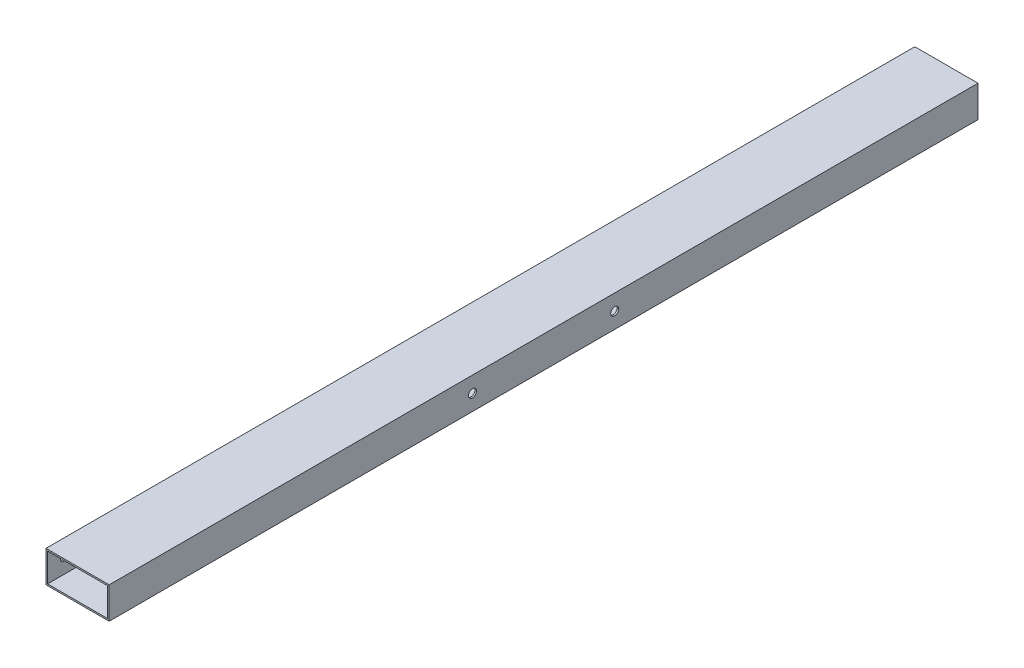
ISO-10303-21;
HEADER;
FILE_DESCRIPTION(('STEP AP214'),'2;1');
FILE_NAME('part.step','',(''),(''),'','','');
FILE_SCHEMA(('AUTOMOTIVE_DESIGN { 1 0 10303 214 1 1 1 1 }'));
ENDSEC;
DATA;
#1=APPLICATION_CONTEXT('core data for automotive mechanical design processes');
#2=APPLICATION_PROTOCOL_DEFINITION('international standard','automotive_design',2000,#1);
#3=PRODUCT_CONTEXT('',#1,'mechanical');
#4=PRODUCT('Part','Part','',(#3));
#5=PRODUCT_RELATED_PRODUCT_CATEGORY('part','',(#4));
#6=PRODUCT_DEFINITION_FORMATION('','',#4);
#7=PRODUCT_DEFINITION_CONTEXT('part definition',#1,'design');
#8=PRODUCT_DEFINITION('design','',#6,#7);
#9=PRODUCT_DEFINITION_SHAPE('','',#8);
#10=(LENGTH_UNIT() NAMED_UNIT(*) SI_UNIT(.MILLI.,.METRE.));
#11=(NAMED_UNIT(*) PLANE_ANGLE_UNIT() SI_UNIT($,.RADIAN.));
#12=(NAMED_UNIT(*) SI_UNIT($,.STERADIAN.) SOLID_ANGLE_UNIT());
#13=UNCERTAINTY_MEASURE_WITH_UNIT(LENGTH_MEASURE(1.E-05),#10,'distance_accuracy_value','');
#14=(GEOMETRIC_REPRESENTATION_CONTEXT(3) GLOBAL_UNCERTAINTY_ASSIGNED_CONTEXT((#13)) GLOBAL_UNIT_ASSIGNED_CONTEXT((#10,
#11,#12)) REPRESENTATION_CONTEXT('',''));
#15=CARTESIAN_POINT('',(0.,0.,0.));
#16=DIRECTION('',(0.,0.,1.));
#17=DIRECTION('',(1.,0.,0.));
#18=AXIS2_PLACEMENT_3D('',#15,#16,#17);
#19=CARTESIAN_POINT('',(0.,0.,550.));
#20=DIRECTION('',(0.,0.,1.));
#21=DIRECTION('',(1.,0.,0.));
#22=AXIS2_PLACEMENT_3D('',#19,#20,#21);
#23=PLANE('',#22);
#24=DIRECTION('',(0.,-1.,0.));
#25=VECTOR('',#24,1.);
#26=CARTESIAN_POINT('',(0.,0.,550.));
#27=LINE('',#26,#25);
#28=CARTESIAN_POINT('',(0.,0.,550.));
#29=VERTEX_POINT('',#28);
#30=CARTESIAN_POINT('',(0.,-20.,550.));
#31=VERTEX_POINT('',#30);
#32=EDGE_CURVE('E170',#29,#31,#27,.T.);
#33=ORIENTED_EDGE('',*,*,#32,.T.);
#34=DIRECTION('',(1.,0.,0.));
#35=VECTOR('',#34,1.);
#36=CARTESIAN_POINT('',(0.,-20.,550.));
#37=LINE('',#36,#35);
#38=CARTESIAN_POINT('',(40.,-20.,550.));
#39=VERTEX_POINT('',#38);
#40=EDGE_CURVE('E173',#31,#39,#37,.T.);
#41=ORIENTED_EDGE('',*,*,#40,.T.);
#42=DIRECTION('',(0.,1.,0.));
#43=VECTOR('',#42,1.);
#44=CARTESIAN_POINT('',(40.,0.,550.));
#45=LINE('',#44,#43);
#46=CARTESIAN_POINT('',(40.,0.,550.));
#47=VERTEX_POINT('',#46);
#48=EDGE_CURVE('E176',#39,#47,#45,.T.);
#49=ORIENTED_EDGE('',*,*,#48,.T.);
#50=DIRECTION('',(-1.,0.,0.));
#51=VECTOR('',#50,1.);
#52=CARTESIAN_POINT('',(0.,0.,550.));
#53=LINE('',#52,#51);
#54=EDGE_CURVE('E178',#47,#29,#53,.T.);
#55=ORIENTED_EDGE('',*,*,#54,.T.);
#56=EDGE_LOOP('',(#33,#41,#49,#55));
#57=FACE_BOUND('',#56,.T.);
#58=DIRECTION('',(1.,0.,0.));
#59=VECTOR('',#58,1.);
#60=CARTESIAN_POINT('',(0.,-19.,550.));
#61=LINE('',#60,#59);
#62=CARTESIAN_POINT('',(1.,-19.,550.));
#63=VERTEX_POINT('',#62);
#64=CARTESIAN_POINT('',(39.,-19.,550.));
#65=VERTEX_POINT('',#64);
#66=EDGE_CURVE('E140',#63,#65,#61,.T.);
#67=ORIENTED_EDGE('',*,*,#66,.F.);
#68=DIRECTION('',(0.,-1.,0.));
#69=VECTOR('',#68,1.);
#70=CARTESIAN_POINT('',(1.,0.,550.));
#71=LINE('',#70,#69);
#72=CARTESIAN_POINT('',(1.,-1.,550.));
#73=VERTEX_POINT('',#72);
#74=EDGE_CURVE('E132',#73,#63,#71,.T.);
#75=ORIENTED_EDGE('',*,*,#74,.F.);
#76=DIRECTION('',(-1.,0.,0.));
#77=VECTOR('',#76,1.);
#78=CARTESIAN_POINT('',(0.,-1.,550.));
#79=LINE('',#78,#77);
#80=CARTESIAN_POINT('',(39.,-1.,550.));
#81=VERTEX_POINT('',#80);
#82=EDGE_CURVE('E154',#81,#73,#79,.T.);
#83=ORIENTED_EDGE('',*,*,#82,.F.);
#84=DIRECTION('',(0.,1.,0.));
#85=VECTOR('',#84,1.);
#86=CARTESIAN_POINT('',(39.,0.,550.));
#87=LINE('',#86,#85);
#88=EDGE_CURVE('E152',#65,#81,#87,.T.);
#89=ORIENTED_EDGE('',*,*,#88,.F.);
#90=EDGE_LOOP('',(#67,#75,#83,#89));
#91=FACE_BOUND('',#90,.T.);
#92=ADVANCED_FACE('F65',(#57,#91),#23,.T.);
#93=CARTESIAN_POINT('',(0.,0.,0.));
#94=DIRECTION('',(0.,0.,1.));
#95=DIRECTION('',(1.,0.,0.));
#96=AXIS2_PLACEMENT_3D('',#93,#94,#95);
#97=PLANE('',#96);
#98=DIRECTION('',(0.,-1.,0.));
#99=VECTOR('',#98,1.);
#100=CARTESIAN_POINT('',(0.,0.,0.));
#101=LINE('',#100,#99);
#102=CARTESIAN_POINT('',(0.,0.,0.));
#103=VERTEX_POINT('',#102);
#104=CARTESIAN_POINT('',(0.,-20.,0.));
#105=VERTEX_POINT('',#104);
#106=EDGE_CURVE('E148',#103,#105,#101,.T.);
#107=ORIENTED_EDGE('',*,*,#106,.F.);
#108=DIRECTION('',(-1.,0.,0.));
#109=VECTOR('',#108,1.);
#110=CARTESIAN_POINT('',(0.,0.,0.));
#111=LINE('',#110,#109);
#112=CARTESIAN_POINT('',(40.,0.,0.));
#113=VERTEX_POINT('',#112);
#114=EDGE_CURVE('E174',#113,#103,#111,.T.);
#115=ORIENTED_EDGE('',*,*,#114,.F.);
#116=DIRECTION('',(0.,1.,0.));
#117=VECTOR('',#116,1.);
#118=CARTESIAN_POINT('',(40.,0.,0.));
#119=LINE('',#118,#117);
#120=CARTESIAN_POINT('',(40.,-20.,0.));
#121=VERTEX_POINT('',#120);
#122=EDGE_CURVE('E185',#121,#113,#119,.T.);
#123=ORIENTED_EDGE('',*,*,#122,.F.);
#124=DIRECTION('',(1.,0.,0.));
#125=VECTOR('',#124,1.);
#126=CARTESIAN_POINT('',(0.,-20.,0.));
#127=LINE('',#126,#125);
#128=EDGE_CURVE('E183',#105,#121,#127,.T.);
#129=ORIENTED_EDGE('',*,*,#128,.F.);
#130=EDGE_LOOP('',(#107,#115,#123,#129));
#131=FACE_BOUND('',#130,.T.);
#132=DIRECTION('',(0.,-1.,0.));
#133=VECTOR('',#132,1.);
#134=CARTESIAN_POINT('',(1.,0.,0.));
#135=LINE('',#134,#133);
#136=CARTESIAN_POINT('',(1.,-1.,0.));
#137=VERTEX_POINT('',#136);
#138=CARTESIAN_POINT('',(1.,-19.,0.));
#139=VERTEX_POINT('',#138);
#140=EDGE_CURVE('E90',#137,#139,#135,.T.);
#141=ORIENTED_EDGE('',*,*,#140,.T.);
#142=DIRECTION('',(1.,0.,0.));
#143=VECTOR('',#142,1.);
#144=CARTESIAN_POINT('',(0.,-19.,0.));
#145=LINE('',#144,#143);
#146=CARTESIAN_POINT('',(39.,-19.,0.));
#147=VERTEX_POINT('',#146);
#148=EDGE_CURVE('E147',#139,#147,#145,.T.);
#149=ORIENTED_EDGE('',*,*,#148,.T.);
#150=DIRECTION('',(0.,1.,0.));
#151=VECTOR('',#150,1.);
#152=CARTESIAN_POINT('',(39.,0.,0.));
#153=LINE('',#152,#151);
#154=CARTESIAN_POINT('',(39.,-1.,0.));
#155=VERTEX_POINT('',#154);
#156=EDGE_CURVE('E162',#147,#155,#153,.T.);
#157=ORIENTED_EDGE('',*,*,#156,.T.);
#158=DIRECTION('',(-1.,0.,0.));
#159=VECTOR('',#158,1.);
#160=CARTESIAN_POINT('',(0.,-1.,0.));
#161=LINE('',#160,#159);
#162=EDGE_CURVE('E141',#155,#137,#161,.T.);
#163=ORIENTED_EDGE('',*,*,#162,.T.);
#164=EDGE_LOOP('',(#141,#149,#157,#163));
#165=FACE_BOUND('',#164,.T.);
#166=ADVANCED_FACE('F248',(#131,#165),#97,.F.);
#167=CARTESIAN_POINT('',(0.,0.,550.));
#168=DIRECTION('',(1.,0.,0.));
#169=DIRECTION('',(0.,0.,-1.));
#170=AXIS2_PLACEMENT_3D('',#167,#168,#169);
#171=PLANE('',#170);
#172=CARTESIAN_POINT('',(0.,-10.,190.));
#173=DIRECTION('',(-1.,0.,0.));
#174=DIRECTION('',(0.,0.,1.));
#175=AXIS2_PLACEMENT_3D('',#172,#173,#174);
#176=CIRCLE('',#175,1.59999999999999);
#177=CARTESIAN_POINT('',(0.,-10.,191.6));
#178=VERTEX_POINT('',#177);
#179=EDGE_CURVE('E211',#178,#178,#176,.T.);
#180=ORIENTED_EDGE('',*,*,#179,.F.);
#181=EDGE_LOOP('',(#180));
#182=FACE_BOUND('',#181,.T.);
#183=CARTESIAN_POINT('',(0.,-10.,170.));
#184=DIRECTION('',(-1.,0.,0.));
#185=DIRECTION('',(0.,0.,1.));
#186=AXIS2_PLACEMENT_3D('',#183,#184,#185);
#187=CIRCLE('',#186,1.59999999999999);
#188=CARTESIAN_POINT('',(0.,-10.,171.6));
#189=VERTEX_POINT('',#188);
#190=EDGE_CURVE('E217',#189,#189,#187,.T.);
#191=ORIENTED_EDGE('',*,*,#190,.F.);
#192=EDGE_LOOP('',(#191));
#193=FACE_BOUND('',#192,.T.);
#194=CARTESIAN_POINT('',(0.,-10.,320.));
#195=DIRECTION('',(1.,0.,0.));
#196=DIRECTION('',(0.,0.,-1.));
#197=AXIS2_PLACEMENT_3D('',#194,#195,#196);
#198=CIRCLE('',#197,2.50000000000002);
#199=CARTESIAN_POINT('',(0.,-10.,317.5));
#200=VERTEX_POINT('',#199);
#201=EDGE_CURVE('E205',#200,#200,#198,.T.);
#202=ORIENTED_EDGE('',*,*,#201,.T.);
#203=EDGE_LOOP('',(#202));
#204=FACE_BOUND('',#203,.T.);
#205=CARTESIAN_POINT('',(0.,-10.,230.));
#206=DIRECTION('',(1.,0.,0.));
#207=DIRECTION('',(0.,0.,-1.));
#208=AXIS2_PLACEMENT_3D('',#205,#206,#207);
#209=CIRCLE('',#208,2.5);
#210=CARTESIAN_POINT('',(0.,-10.,227.5));
#211=VERTEX_POINT('',#210);
#212=EDGE_CURVE('E215',#211,#211,#209,.T.);
#213=ORIENTED_EDGE('',*,*,#212,.T.);
#214=EDGE_LOOP('',(#213));
#215=FACE_BOUND('',#214,.T.);
#216=CARTESIAN_POINT('',(0.,-10.,539.996387591484));
#217=DIRECTION('',(-1.,0.,0.));
#218=DIRECTION('',(0.,0.,1.));
#219=AXIS2_PLACEMENT_3D('',#216,#217,#218);
#220=CIRCLE('',#219,1.7500000000001);
#221=CARTESIAN_POINT('',(0.,-10.,541.746387591484));
#222=VERTEX_POINT('',#221);
#223=EDGE_CURVE('E198',#222,#222,#220,.T.);
#224=ORIENTED_EDGE('',*,*,#223,.F.);
#225=EDGE_LOOP('',(#224));
#226=FACE_BOUND('',#225,.T.);
#227=CARTESIAN_POINT('',(0.,-10.0000000016865,9.99999999971425));
#228=DIRECTION('',(-1.,0.,0.));
#229=DIRECTION('',(0.,0.,1.));
#230=AXIS2_PLACEMENT_3D('',#227,#228,#229);
#231=CIRCLE('',#230,1.75000000027376);
#232=CARTESIAN_POINT('',(0.,-10.0000000016865,11.749999999988));
#233=VERTEX_POINT('',#232);
#234=EDGE_CURVE('E238',#233,#233,#231,.T.);
#235=ORIENTED_EDGE('',*,*,#234,.F.);
#236=EDGE_LOOP('',(#235));
#237=FACE_BOUND('',#236,.T.);
#238=ORIENTED_EDGE('',*,*,#106,.T.);
#239=DIRECTION('',(0.,0.,-1.));
#240=VECTOR('',#239,1.);
#241=CARTESIAN_POINT('',(0.,-20.,550.));
#242=LINE('',#241,#240);
#243=EDGE_CURVE('E12',#31,#105,#242,.T.);
#244=ORIENTED_EDGE('',*,*,#243,.F.);
#245=ORIENTED_EDGE('',*,*,#32,.F.);
#246=DIRECTION('',(0.,0.,-1.));
#247=VECTOR('',#246,1.);
#248=CARTESIAN_POINT('',(0.,0.,550.));
#249=LINE('',#248,#247);
#250=EDGE_CURVE('E180',#29,#103,#249,.T.);
#251=ORIENTED_EDGE('',*,*,#250,.T.);
#252=EDGE_LOOP('',(#238,#244,#245,#251));
#253=FACE_BOUND('',#252,.T.);
#254=ADVANCED_FACE('F67',(#182,#193,#204,#215,#226,#237,#253),#171,.F.);
#255=CARTESIAN_POINT('',(0.,-20.,550.));
#256=DIRECTION('',(0.,1.,0.));
#257=DIRECTION('',(0.,0.,1.));
#258=AXIS2_PLACEMENT_3D('',#255,#256,#257);
#259=PLANE('',#258);
#260=ORIENTED_EDGE('',*,*,#128,.T.);
#261=DIRECTION('',(0.,0.,-1.));
#262=VECTOR('',#261,1.);
#263=CARTESIAN_POINT('',(40.,-20.,550.));
#264=LINE('',#263,#262);
#265=EDGE_CURVE('E74',#39,#121,#264,.T.);
#266=ORIENTED_EDGE('',*,*,#265,.F.);
#267=ORIENTED_EDGE('',*,*,#40,.F.);
#268=ORIENTED_EDGE('',*,*,#243,.T.);
#269=EDGE_LOOP('',(#260,#266,#267,#268));
#270=FACE_BOUND('',#269,.T.);
#271=ADVANCED_FACE('F247',(#270),#259,.F.);
#272=CARTESIAN_POINT('',(40.,0.,550.));
#273=DIRECTION('',(-1.,0.,0.));
#274=DIRECTION('',(0.,0.,1.));
#275=AXIS2_PLACEMENT_3D('',#272,#273,#274);
#276=PLANE('',#275);
#277=CARTESIAN_POINT('',(40.,-10.,320.));
#278=DIRECTION('',(1.,0.,0.));
#279=DIRECTION('',(0.,0.,-1.));
#280=AXIS2_PLACEMENT_3D('',#277,#278,#279);
#281=CIRCLE('',#280,2.50000000000002);
#282=CARTESIAN_POINT('',(40.,-10.,317.5));
#283=VERTEX_POINT('',#282);
#284=EDGE_CURVE('E226',#283,#283,#281,.T.);
#285=ORIENTED_EDGE('',*,*,#284,.F.);
#286=EDGE_LOOP('',(#285));
#287=FACE_BOUND('',#286,.T.);
#288=CARTESIAN_POINT('',(40.,-10.,230.));
#289=DIRECTION('',(1.,0.,0.));
#290=DIRECTION('',(0.,0.,-1.));
#291=AXIS2_PLACEMENT_3D('',#288,#289,#290);
#292=CIRCLE('',#291,2.5);
#293=CARTESIAN_POINT('',(40.,-10.,227.5));
#294=VERTEX_POINT('',#293);
#295=EDGE_CURVE('E229',#294,#294,#292,.T.);
#296=ORIENTED_EDGE('',*,*,#295,.F.);
#297=EDGE_LOOP('',(#296));
#298=FACE_BOUND('',#297,.T.);
#299=ORIENTED_EDGE('',*,*,#122,.T.);
#300=DIRECTION('',(0.,0.,-1.));
#301=VECTOR('',#300,1.);
#302=CARTESIAN_POINT('',(40.,0.,550.));
#303=LINE('',#302,#301);
#304=EDGE_CURVE('E190',#47,#113,#303,.T.);
#305=ORIENTED_EDGE('',*,*,#304,.F.);
#306=ORIENTED_EDGE('',*,*,#48,.F.);
#307=ORIENTED_EDGE('',*,*,#265,.T.);
#308=EDGE_LOOP('',(#299,#305,#306,#307));
#309=FACE_BOUND('',#308,.T.);
#310=ADVANCED_FACE('F267',(#287,#298,#309),#276,.F.);
#311=CARTESIAN_POINT('',(0.,0.,550.));
#312=DIRECTION('',(0.,-1.,0.));
#313=DIRECTION('',(0.,0.,-1.));
#314=AXIS2_PLACEMENT_3D('',#311,#312,#313);
#315=PLANE('',#314);
#316=ORIENTED_EDGE('',*,*,#114,.T.);
#317=ORIENTED_EDGE('',*,*,#250,.F.);
#318=ORIENTED_EDGE('',*,*,#54,.F.);
#319=ORIENTED_EDGE('',*,*,#304,.T.);
#320=EDGE_LOOP('',(#316,#317,#318,#319));
#321=FACE_BOUND('',#320,.T.);
#322=ADVANCED_FACE('F265',(#321),#315,.F.);
#323=CARTESIAN_POINT('',(1.,0.,550.));
#324=DIRECTION('',(1.,0.,0.));
#325=DIRECTION('',(0.,0.,-1.));
#326=AXIS2_PLACEMENT_3D('',#323,#324,#325);
#327=PLANE('',#326);
#328=CARTESIAN_POINT('',(0.999999999999999,-10.,190.));
#329=DIRECTION('',(1.,0.,0.));
#330=DIRECTION('',(0.,0.,-1.));
#331=AXIS2_PLACEMENT_3D('',#328,#329,#330);
#332=CIRCLE('',#331,1.59999999999999);
#333=CARTESIAN_POINT('',(0.999999999999999,-10.,188.4));
#334=VERTEX_POINT('',#333);
#335=EDGE_CURVE('E69',#334,#334,#332,.T.);
#336=ORIENTED_EDGE('',*,*,#335,.F.);
#337=EDGE_LOOP('',(#336));
#338=FACE_BOUND('',#337,.T.);
#339=CARTESIAN_POINT('',(0.999999999999999,-10.,170.));
#340=DIRECTION('',(1.,0.,0.));
#341=DIRECTION('',(0.,0.,-1.));
#342=AXIS2_PLACEMENT_3D('',#339,#340,#341);
#343=CIRCLE('',#342,1.59999999999999);
#344=CARTESIAN_POINT('',(0.999999999999999,-10.,168.4));
#345=VERTEX_POINT('',#344);
#346=EDGE_CURVE('E209',#345,#345,#343,.T.);
#347=ORIENTED_EDGE('',*,*,#346,.F.);
#348=EDGE_LOOP('',(#347));
#349=FACE_BOUND('',#348,.T.);
#350=CARTESIAN_POINT('',(1.,-10.,320.));
#351=DIRECTION('',(1.,0.,0.));
#352=DIRECTION('',(0.,0.,-1.));
#353=AXIS2_PLACEMENT_3D('',#350,#351,#352);
#354=CIRCLE('',#353,2.50000000000002);
#355=CARTESIAN_POINT('',(1.,-10.,317.5));
#356=VERTEX_POINT('',#355);
#357=EDGE_CURVE('E208',#356,#356,#354,.T.);
#358=ORIENTED_EDGE('',*,*,#357,.F.);
#359=EDGE_LOOP('',(#358));
#360=FACE_BOUND('',#359,.T.);
#361=CARTESIAN_POINT('',(1.,-10.,230.));
#362=DIRECTION('',(1.,0.,0.));
#363=DIRECTION('',(0.,0.,-1.));
#364=AXIS2_PLACEMENT_3D('',#361,#362,#363);
#365=CIRCLE('',#364,2.5);
#366=CARTESIAN_POINT('',(1.,-10.,227.5));
#367=VERTEX_POINT('',#366);
#368=EDGE_CURVE('E204',#367,#367,#365,.T.);
#369=ORIENTED_EDGE('',*,*,#368,.F.);
#370=EDGE_LOOP('',(#369));
#371=FACE_BOUND('',#370,.T.);
#372=CARTESIAN_POINT('',(1.,-10.,539.996387591484));
#373=DIRECTION('',(1.,0.,0.));
#374=DIRECTION('',(0.,0.,-1.));
#375=AXIS2_PLACEMENT_3D('',#372,#373,#374);
#376=CIRCLE('',#375,1.7500000000001);
#377=CARTESIAN_POINT('',(1.,-10.,538.246387591484));
#378=VERTEX_POINT('',#377);
#379=EDGE_CURVE('E160',#378,#378,#376,.T.);
#380=ORIENTED_EDGE('',*,*,#379,.F.);
#381=EDGE_LOOP('',(#380));
#382=FACE_BOUND('',#381,.T.);
#383=CARTESIAN_POINT('',(1.,-10.0000000016865,9.99999999971425));
#384=DIRECTION('',(1.,0.,0.));
#385=DIRECTION('',(0.,0.,-1.));
#386=AXIS2_PLACEMENT_3D('',#383,#384,#385);
#387=CIRCLE('',#386,1.75000000027376);
#388=CARTESIAN_POINT('',(1.,-10.0000000016865,8.24999999944049));
#389=VERTEX_POINT('',#388);
#390=EDGE_CURVE('E195',#389,#389,#387,.T.);
#391=ORIENTED_EDGE('',*,*,#390,.F.);
#392=EDGE_LOOP('',(#391));
#393=FACE_BOUND('',#392,.T.);
#394=ORIENTED_EDGE('',*,*,#140,.F.);
#395=DIRECTION('',(0.,0.,-1.));
#396=VECTOR('',#395,1.);
#397=CARTESIAN_POINT('',(1.,-1.,550.));
#398=LINE('',#397,#396);
#399=EDGE_CURVE('E136',#73,#137,#398,.T.);
#400=ORIENTED_EDGE('',*,*,#399,.F.);
#401=ORIENTED_EDGE('',*,*,#74,.T.);
#402=DIRECTION('',(0.,0.,-1.));
#403=VECTOR('',#402,1.);
#404=CARTESIAN_POINT('',(1.,-19.,550.));
#405=LINE('',#404,#403);
#406=EDGE_CURVE('E135',#63,#139,#405,.T.);
#407=ORIENTED_EDGE('',*,*,#406,.T.);
#408=EDGE_LOOP('',(#394,#400,#401,#407));
#409=FACE_BOUND('',#408,.T.);
#410=ADVANCED_FACE('F134',(#338,#349,#360,#371,#382,#393,#409),#327,.T.);
#411=CARTESIAN_POINT('',(0.,-19.,550.));
#412=DIRECTION('',(0.,1.,0.));
#413=DIRECTION('',(0.,0.,1.));
#414=AXIS2_PLACEMENT_3D('',#411,#412,#413);
#415=PLANE('',#414);
#416=ORIENTED_EDGE('',*,*,#148,.F.);
#417=ORIENTED_EDGE('',*,*,#406,.F.);
#418=ORIENTED_EDGE('',*,*,#66,.T.);
#419=DIRECTION('',(0.,0.,-1.));
#420=VECTOR('',#419,1.);
#421=CARTESIAN_POINT('',(39.,-19.,550.));
#422=LINE('',#421,#420);
#423=EDGE_CURVE('E149',#65,#147,#422,.T.);
#424=ORIENTED_EDGE('',*,*,#423,.T.);
#425=EDGE_LOOP('',(#416,#417,#418,#424));
#426=FACE_BOUND('',#425,.T.);
#427=ADVANCED_FACE('F144',(#426),#415,.T.);
#428=CARTESIAN_POINT('',(39.,0.,550.));
#429=DIRECTION('',(-1.,0.,0.));
#430=DIRECTION('',(0.,0.,1.));
#431=AXIS2_PLACEMENT_3D('',#428,#429,#430);
#432=PLANE('',#431);
#433=CARTESIAN_POINT('',(39.,-10.,320.));
#434=DIRECTION('',(-1.,0.,0.));
#435=DIRECTION('',(0.,0.,1.));
#436=AXIS2_PLACEMENT_3D('',#433,#434,#435);
#437=CIRCLE('',#436,2.50000000000002);
#438=CARTESIAN_POINT('',(39.,-10.,322.5));
#439=VERTEX_POINT('',#438);
#440=EDGE_CURVE('E206',#439,#439,#437,.T.);
#441=ORIENTED_EDGE('',*,*,#440,.F.);
#442=EDGE_LOOP('',(#441));
#443=FACE_BOUND('',#442,.T.);
#444=CARTESIAN_POINT('',(39.,-10.,230.));
#445=DIRECTION('',(-1.,0.,0.));
#446=DIRECTION('',(0.,0.,1.));
#447=AXIS2_PLACEMENT_3D('',#444,#445,#446);
#448=CIRCLE('',#447,2.5);
#449=CARTESIAN_POINT('',(39.,-10.,232.5));
#450=VERTEX_POINT('',#449);
#451=EDGE_CURVE('E201',#450,#450,#448,.T.);
#452=ORIENTED_EDGE('',*,*,#451,.F.);
#453=EDGE_LOOP('',(#452));
#454=FACE_BOUND('',#453,.T.);
#455=ORIENTED_EDGE('',*,*,#156,.F.);
#456=ORIENTED_EDGE('',*,*,#423,.F.);
#457=ORIENTED_EDGE('',*,*,#88,.T.);
#458=DIRECTION('',(0.,0.,-1.));
#459=VECTOR('',#458,1.);
#460=CARTESIAN_POINT('',(39.,-1.,550.));
#461=LINE('',#460,#459);
#462=EDGE_CURVE('E82',#81,#155,#461,.T.);
#463=ORIENTED_EDGE('',*,*,#462,.T.);
#464=EDGE_LOOP('',(#455,#456,#457,#463));
#465=FACE_BOUND('',#464,.T.);
#466=ADVANCED_FACE('F292',(#443,#454,#465),#432,.T.);
#467=CARTESIAN_POINT('',(0.,-1.,550.));
#468=DIRECTION('',(0.,-1.,0.));
#469=DIRECTION('',(0.,0.,-1.));
#470=AXIS2_PLACEMENT_3D('',#467,#468,#469);
#471=PLANE('',#470);
#472=ORIENTED_EDGE('',*,*,#162,.F.);
#473=ORIENTED_EDGE('',*,*,#462,.F.);
#474=ORIENTED_EDGE('',*,*,#82,.T.);
#475=ORIENTED_EDGE('',*,*,#399,.T.);
#476=EDGE_LOOP('',(#472,#473,#474,#475));
#477=FACE_BOUND('',#476,.T.);
#478=ADVANCED_FACE('F294',(#477),#471,.T.);
#479=CARTESIAN_POINT('',(1.5,-10.0000000016865,9.99999999971425));
#480=DIRECTION('',(-1.,0.,0.));
#481=DIRECTION('',(0.,0.,1.));
#482=AXIS2_PLACEMENT_3D('',#479,#480,#481);
#483=CYLINDRICAL_SURFACE('',#482,1.75000000027376);
#484=ORIENTED_EDGE('',*,*,#390,.T.);
#485=EDGE_LOOP('',(#484));
#486=FACE_BOUND('',#485,.T.);
#487=ORIENTED_EDGE('',*,*,#234,.T.);
#488=EDGE_LOOP('',(#487));
#489=FACE_BOUND('',#488,.T.);
#490=ADVANCED_FACE('F243',(#486,#489),#483,.F.);
#491=CARTESIAN_POINT('',(1.5,-10.,539.996387591484));
#492=DIRECTION('',(-1.,0.,0.));
#493=DIRECTION('',(0.,0.,1.));
#494=AXIS2_PLACEMENT_3D('',#491,#492,#493);
#495=CYLINDRICAL_SURFACE('',#494,1.7500000000001);
#496=ORIENTED_EDGE('',*,*,#379,.T.);
#497=EDGE_LOOP('',(#496));
#498=FACE_BOUND('',#497,.T.);
#499=ORIENTED_EDGE('',*,*,#223,.T.);
#500=EDGE_LOOP('',(#499));
#501=FACE_BOUND('',#500,.T.);
#502=ADVANCED_FACE('F300',(#498,#501),#495,.F.);
#503=CARTESIAN_POINT('',(0.,-10.,230.));
#504=DIRECTION('',(1.,0.,0.));
#505=DIRECTION('',(0.,0.,-1.));
#506=AXIS2_PLACEMENT_3D('',#503,#504,#505);
#507=CYLINDRICAL_SURFACE('',#506,2.5);
#508=ORIENTED_EDGE('',*,*,#451,.T.);
#509=EDGE_LOOP('',(#508));
#510=FACE_BOUND('',#509,.T.);
#511=ORIENTED_EDGE('',*,*,#295,.T.);
#512=EDGE_LOOP('',(#511));
#513=FACE_BOUND('',#512,.T.);
#514=ADVANCED_FACE('F303',(#510,#513),#507,.F.);
#515=CARTESIAN_POINT('',(0.,-10.,320.));
#516=DIRECTION('',(1.,0.,0.));
#517=DIRECTION('',(0.,0.,-1.));
#518=AXIS2_PLACEMENT_3D('',#515,#516,#517);
#519=CYLINDRICAL_SURFACE('',#518,2.50000000000002);
#520=ORIENTED_EDGE('',*,*,#440,.T.);
#521=EDGE_LOOP('',(#520));
#522=FACE_BOUND('',#521,.T.);
#523=ORIENTED_EDGE('',*,*,#284,.T.);
#524=EDGE_LOOP('',(#523));
#525=FACE_BOUND('',#524,.T.);
#526=ADVANCED_FACE('F307',(#522,#525),#519,.F.);
#527=ORIENTED_EDGE('',*,*,#368,.T.);
#528=EDGE_LOOP('',(#527));
#529=FACE_BOUND('',#528,.T.);
#530=ORIENTED_EDGE('',*,*,#212,.F.);
#531=EDGE_LOOP('',(#530));
#532=FACE_BOUND('',#531,.T.);
#533=ADVANCED_FACE('F309',(#529,#532),#507,.F.);
#534=ORIENTED_EDGE('',*,*,#357,.T.);
#535=EDGE_LOOP('',(#534));
#536=FACE_BOUND('',#535,.T.);
#537=ORIENTED_EDGE('',*,*,#201,.F.);
#538=EDGE_LOOP('',(#537));
#539=FACE_BOUND('',#538,.T.);
#540=ADVANCED_FACE('F313',(#536,#539),#519,.F.);
#541=CARTESIAN_POINT('',(10.,-10.,170.));
#542=DIRECTION('',(-1.,0.,0.));
#543=DIRECTION('',(0.,0.,1.));
#544=AXIS2_PLACEMENT_3D('',#541,#542,#543);
#545=CYLINDRICAL_SURFACE('',#544,1.59999999999999);
#546=ORIENTED_EDGE('',*,*,#346,.T.);
#547=EDGE_LOOP('',(#546));
#548=FACE_BOUND('',#547,.T.);
#549=ORIENTED_EDGE('',*,*,#190,.T.);
#550=EDGE_LOOP('',(#549));
#551=FACE_BOUND('',#550,.T.);
#552=ADVANCED_FACE('F314',(#548,#551),#545,.F.);
#553=CARTESIAN_POINT('',(10.,-10.,190.));
#554=DIRECTION('',(-1.,0.,0.));
#555=DIRECTION('',(0.,0.,1.));
#556=AXIS2_PLACEMENT_3D('',#553,#554,#555);
#557=CYLINDRICAL_SURFACE('',#556,1.59999999999999);
#558=ORIENTED_EDGE('',*,*,#335,.T.);
#559=EDGE_LOOP('',(#558));
#560=FACE_BOUND('',#559,.T.);
#561=ORIENTED_EDGE('',*,*,#179,.T.);
#562=EDGE_LOOP('',(#561));
#563=FACE_BOUND('',#562,.T.);
#564=ADVANCED_FACE('F317',(#560,#563),#557,.F.);
#565=CLOSED_SHELL('',(#92,#166,#254,#271,#310,#322,#410,#427,#466,#478,#490,#502,#514,#526,#533,
#540,#552,#564));
#566=MANIFOLD_SOLID_BREP('B2',#565);
#567=ADVANCED_BREP_SHAPE_REPRESENTATION('',(#18,#566),#14);
#568=SHAPE_DEFINITION_REPRESENTATION(#9,#567);
ENDSEC;
END-ISO-10303-21;
